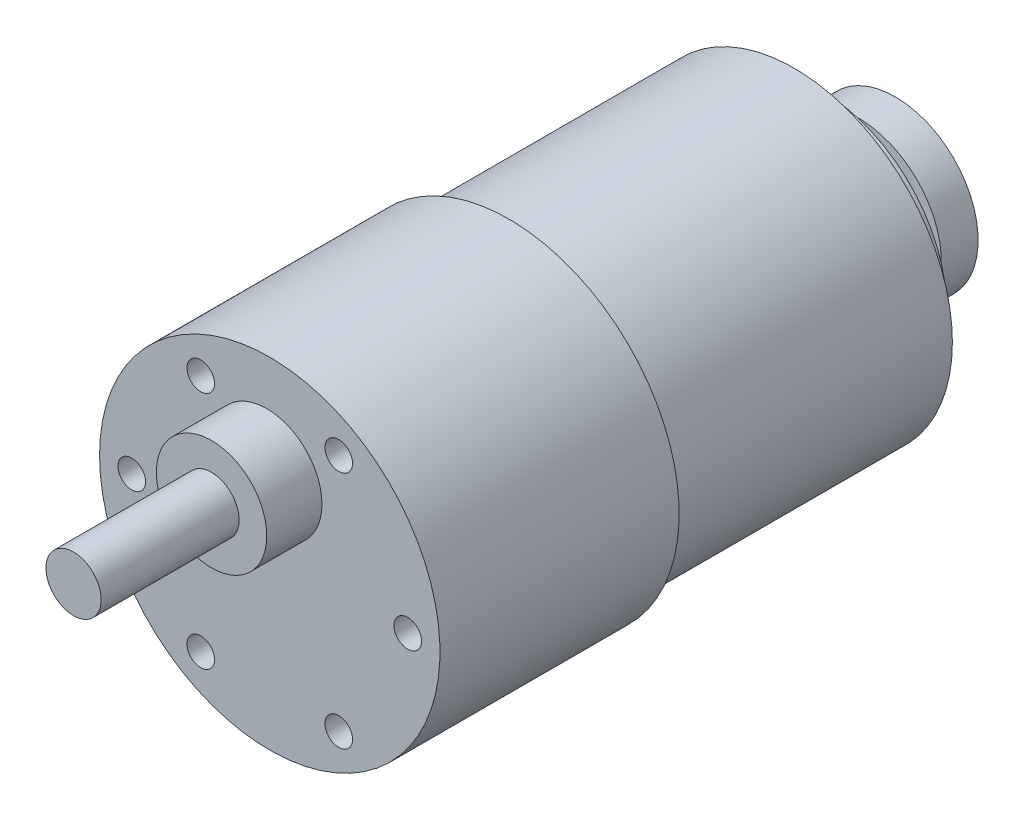
ISO-10303-21;
HEADER;
FILE_DESCRIPTION(('STEP AP214'),'2;1');
FILE_NAME('part.step','',(''),(''),'','','');
FILE_SCHEMA(('AUTOMOTIVE_DESIGN { 1 0 10303 214 1 1 1 1 }'));
ENDSEC;
DATA;
#1=APPLICATION_CONTEXT('core data for automotive mechanical design processes');
#2=APPLICATION_PROTOCOL_DEFINITION('international standard','automotive_design',2000,#1);
#3=PRODUCT_CONTEXT('',#1,'mechanical');
#4=PRODUCT('Part','Part','',(#3));
#5=PRODUCT_RELATED_PRODUCT_CATEGORY('part','',(#4));
#6=PRODUCT_DEFINITION_FORMATION('','',#4);
#7=PRODUCT_DEFINITION_CONTEXT('part definition',#1,'design');
#8=PRODUCT_DEFINITION('design','',#6,#7);
#9=PRODUCT_DEFINITION_SHAPE('','',#8);
#10=(LENGTH_UNIT() NAMED_UNIT(*) SI_UNIT(.MILLI.,.METRE.));
#11=(NAMED_UNIT(*) PLANE_ANGLE_UNIT() SI_UNIT($,.RADIAN.));
#12=(NAMED_UNIT(*) SI_UNIT($,.STERADIAN.) SOLID_ANGLE_UNIT());
#13=UNCERTAINTY_MEASURE_WITH_UNIT(LENGTH_MEASURE(1.E-05),#10,'distance_accuracy_value','');
#14=(GEOMETRIC_REPRESENTATION_CONTEXT(3) GLOBAL_UNCERTAINTY_ASSIGNED_CONTEXT((#13)) GLOBAL_UNIT_ASSIGNED_CONTEXT((#10,
#11,#12)) REPRESENTATION_CONTEXT('',''));
#15=CARTESIAN_POINT('',(0.,0.,0.));
#16=DIRECTION('',(0.,0.,1.));
#17=DIRECTION('',(1.,0.,0.));
#18=AXIS2_PLACEMENT_3D('',#15,#16,#17);
#19=CARTESIAN_POINT('',(0.,0.,26.));
#20=DIRECTION('',(0.,0.,-1.));
#21=DIRECTION('',(-1.,0.,0.));
#22=AXIS2_PLACEMENT_3D('',#19,#20,#21);
#23=CYLINDRICAL_SURFACE('',#22,18.5);
#24=CARTESIAN_POINT('',(0.,0.,26.));
#25=DIRECTION('',(0.,0.,1.));
#26=DIRECTION('',(1.,0.,0.));
#27=AXIS2_PLACEMENT_3D('',#24,#25,#26);
#28=CIRCLE('',#27,18.5);
#29=CARTESIAN_POINT('',(-18.5,0.,26.));
#30=VERTEX_POINT('',#29);
#31=EDGE_CURVE('E36',#30,#30,#28,.T.);
#32=CARTESIAN_POINT('',(0.,0.,0.));
#33=DIRECTION('',(0.,0.,1.));
#34=DIRECTION('',(1.,0.,0.));
#35=AXIS2_PLACEMENT_3D('',#32,#33,#34);
#36=CIRCLE('',#35,18.5);
#37=CARTESIAN_POINT('',(-18.5,0.,0.));
#38=VERTEX_POINT('',#37);
#39=EDGE_CURVE('E40',#38,#38,#36,.T.);
#40=CARTESIAN_POINT('',(-18.5,0.,26.));
#41=CARTESIAN_POINT('',(-18.5,0.,25.7291666666667));
#42=CARTESIAN_POINT('',(-18.5,0.,25.4583333333333));
#43=CARTESIAN_POINT('',(-18.5,0.,24.9166666666667));
#44=CARTESIAN_POINT('',(-18.5,0.,24.6458333333333));
#45=CARTESIAN_POINT('',(-18.5,0.,24.1041666666667));
#46=CARTESIAN_POINT('',(-18.5,0.,23.8333333333333));
#47=CARTESIAN_POINT('',(-18.5,0.,23.2916666666667));
#48=CARTESIAN_POINT('',(-18.5,0.,23.0208333333333));
#49=CARTESIAN_POINT('',(-18.5,0.,22.4791666666667));
#50=CARTESIAN_POINT('',(-18.5,0.,22.2083333333333));
#51=CARTESIAN_POINT('',(-18.5,0.,21.6666666666667));
#52=CARTESIAN_POINT('',(-18.5,0.,21.3958333333333));
#53=CARTESIAN_POINT('',(-18.5,0.,20.8541666666667));
#54=CARTESIAN_POINT('',(-18.5,0.,20.5833333333333));
#55=CARTESIAN_POINT('',(-18.5,0.,20.0416666666667));
#56=CARTESIAN_POINT('',(-18.5,0.,19.7708333333333));
#57=CARTESIAN_POINT('',(-18.5,0.,19.2291666666667));
#58=CARTESIAN_POINT('',(-18.5,0.,18.9583333333333));
#59=CARTESIAN_POINT('',(-18.5,0.,18.4166666666667));
#60=CARTESIAN_POINT('',(-18.5,0.,18.1458333333333));
#61=CARTESIAN_POINT('',(-18.5,0.,17.6041666666667));
#62=CARTESIAN_POINT('',(-18.5,0.,17.3333333333333));
#63=CARTESIAN_POINT('',(-18.5,0.,16.7916666666667));
#64=CARTESIAN_POINT('',(-18.5,0.,16.5208333333333));
#65=CARTESIAN_POINT('',(-18.5,0.,15.9791666666667));
#66=CARTESIAN_POINT('',(-18.5,0.,15.7083333333333));
#67=CARTESIAN_POINT('',(-18.5,0.,15.1666666666667));
#68=CARTESIAN_POINT('',(-18.5,0.,14.8958333333333));
#69=CARTESIAN_POINT('',(-18.5,0.,14.3541666666667));
#70=CARTESIAN_POINT('',(-18.5,0.,14.0833333333333));
#71=CARTESIAN_POINT('',(-18.5,0.,13.5416666666667));
#72=CARTESIAN_POINT('',(-18.5,0.,13.2708333333333));
#73=CARTESIAN_POINT('',(-18.5,0.,12.7291666666667));
#74=CARTESIAN_POINT('',(-18.5,0.,12.4583333333333));
#75=CARTESIAN_POINT('',(-18.5,0.,11.9166666666667));
#76=CARTESIAN_POINT('',(-18.5,0.,11.6458333333333));
#77=CARTESIAN_POINT('',(-18.5,0.,11.1041666666667));
#78=CARTESIAN_POINT('',(-18.5,0.,10.8333333333333));
#79=CARTESIAN_POINT('',(-18.5,0.,10.2916666666667));
#80=CARTESIAN_POINT('',(-18.5,0.,10.0208333333333));
#81=CARTESIAN_POINT('',(-18.5,0.,9.47916666666667));
#82=CARTESIAN_POINT('',(-18.5,0.,9.20833333333333));
#83=CARTESIAN_POINT('',(-18.5,0.,8.66666666666667));
#84=CARTESIAN_POINT('',(-18.5,0.,8.39583333333333));
#85=CARTESIAN_POINT('',(-18.5,0.,7.85416666666667));
#86=CARTESIAN_POINT('',(-18.5,0.,7.58333333333333));
#87=CARTESIAN_POINT('',(-18.5,0.,7.04166666666667));
#88=CARTESIAN_POINT('',(-18.5,0.,6.77083333333333));
#89=CARTESIAN_POINT('',(-18.5,0.,6.22916666666667));
#90=CARTESIAN_POINT('',(-18.5,0.,5.95833333333333));
#91=CARTESIAN_POINT('',(-18.5,0.,5.41666666666667));
#92=CARTESIAN_POINT('',(-18.5,0.,5.14583333333333));
#93=CARTESIAN_POINT('',(-18.5,0.,4.60416666666667));
#94=CARTESIAN_POINT('',(-18.5,0.,4.33333333333333));
#95=CARTESIAN_POINT('',(-18.5,0.,3.79166666666667));
#96=CARTESIAN_POINT('',(-18.5,0.,3.52083333333333));
#97=CARTESIAN_POINT('',(-18.5,0.,2.97916666666667));
#98=CARTESIAN_POINT('',(-18.5,0.,2.70833333333333));
#99=CARTESIAN_POINT('',(-18.5,0.,2.16666666666667));
#100=CARTESIAN_POINT('',(-18.5,0.,1.89583333333333));
#101=CARTESIAN_POINT('',(-18.5,0.,1.35416666666667));
#102=CARTESIAN_POINT('',(-18.5,0.,1.08333333333333));
#103=CARTESIAN_POINT('',(-18.5,0.,0.541666666666667));
#104=CARTESIAN_POINT('',(-18.5,0.,0.270833333333334));
#105=CARTESIAN_POINT('',(-18.5,0.,0.));
#106=B_SPLINE_CURVE_WITH_KNOTS('',3,(#40,#41,#42,#43,#44,#45,#46,#47,#48,#49,#50,#51,#52,#53,
#54,#55,#56,#57,#58,#59,#60,#61,#62,#63,#64,#65,#66,#67,#68,#69,#70,#71,#72,#73,#74,#75,#76,#77,
#78,#79,#80,#81,#82,#83,#84,#85,#86,#87,#88,#89,#90,#91,#92,#93,#94,#95,#96,#97,#98,#99,#100,
#101,#102,#103,#104,#105),.UNSPECIFIED.,.F.,.F.,(4,2,2,2,2,2,2,2,2,2,2,2,2,2,2,2,2,2,2,2,2,2,2,
2,2,2,2,2,2,2,2,2,4),(0.,0.812500000000001,1.625,2.4375,3.25,4.0625,4.875,5.6875,6.5,7.3125,
8.125,8.9375,9.75,10.5625,11.375,12.1875,13.,13.8125,14.625,15.4375,16.25,17.0625,17.875,
18.6875,19.5,20.3125,21.125,21.9375,22.75,23.5625,24.375,25.1875,26.),.UNSPECIFIED.);
#107=EDGE_CURVE('BSEAM30',#30,#38,#106,.T.);
#108=ORIENTED_EDGE('',*,*,#31,.F.);
#109=ORIENTED_EDGE('',*,*,#39,.T.);
#110=ORIENTED_EDGE('',*,*,#107,.T.);
#111=ORIENTED_EDGE('',*,*,#107,.F.);
#112=EDGE_LOOP('',(#108,#110,#109,#111));
#113=FACE_BOUND('',#112,.T.);
#114=ADVANCED_FACE('F30',(#113),#23,.T.);
#115=CARTESIAN_POINT('',(0.,0.,26.));
#116=DIRECTION('',(0.,0.,1.));
#117=DIRECTION('',(1.,0.,0.));
#118=AXIS2_PLACEMENT_3D('',#115,#116,#117);
#119=PLANE('',#118);
#120=CARTESIAN_POINT('',(-7.5,-12.9903810567666,26.));
#121=DIRECTION('',(0.,0.,1.));
#122=DIRECTION('',(1.,0.,0.));
#123=AXIS2_PLACEMENT_3D('',#120,#121,#122);
#124=CIRCLE('',#123,1.5);
#125=CARTESIAN_POINT('',(-6.,-12.9903810567666,26.));
#126=VERTEX_POINT('',#125);
#127=EDGE_CURVE('E107',#126,#126,#124,.T.);
#128=ORIENTED_EDGE('',*,*,#127,.F.);
#129=EDGE_LOOP('',(#128));
#130=FACE_BOUND('',#129,.T.);
#131=CARTESIAN_POINT('',(-15.,0.,26.));
#132=DIRECTION('',(0.,0.,1.));
#133=DIRECTION('',(1.,0.,0.));
#134=AXIS2_PLACEMENT_3D('',#131,#132,#133);
#135=CIRCLE('',#134,1.5);
#136=CARTESIAN_POINT('',(-13.5,0.,26.));
#137=VERTEX_POINT('',#136);
#138=EDGE_CURVE('E101',#137,#137,#135,.T.);
#139=ORIENTED_EDGE('',*,*,#138,.F.);
#140=EDGE_LOOP('',(#139));
#141=FACE_BOUND('',#140,.T.);
#142=CARTESIAN_POINT('',(-7.5,12.9903810567666,26.));
#143=DIRECTION('',(0.,0.,1.));
#144=DIRECTION('',(1.,0.,0.));
#145=AXIS2_PLACEMENT_3D('',#142,#143,#144);
#146=CIRCLE('',#145,1.5);
#147=CARTESIAN_POINT('',(-6.,12.9903810567666,26.));
#148=VERTEX_POINT('',#147);
#149=EDGE_CURVE('E95',#148,#148,#146,.T.);
#150=ORIENTED_EDGE('',*,*,#149,.F.);
#151=EDGE_LOOP('',(#150));
#152=FACE_BOUND('',#151,.T.);
#153=CARTESIAN_POINT('',(7.5,12.9903810567666,26.));
#154=DIRECTION('',(0.,0.,1.));
#155=DIRECTION('',(1.,0.,0.));
#156=AXIS2_PLACEMENT_3D('',#153,#154,#155);
#157=CIRCLE('',#156,1.5);
#158=CARTESIAN_POINT('',(9.,12.9903810567666,26.));
#159=VERTEX_POINT('',#158);
#160=EDGE_CURVE('E89',#159,#159,#157,.T.);
#161=ORIENTED_EDGE('',*,*,#160,.F.);
#162=EDGE_LOOP('',(#161));
#163=FACE_BOUND('',#162,.T.);
#164=CARTESIAN_POINT('',(7.5,-12.9903810567666,26.));
#165=DIRECTION('',(0.,0.,1.));
#166=DIRECTION('',(1.,0.,0.));
#167=AXIS2_PLACEMENT_3D('',#164,#165,#166);
#168=CIRCLE('',#167,1.5);
#169=CARTESIAN_POINT('',(9.,-12.9903810567666,26.));
#170=VERTEX_POINT('',#169);
#171=EDGE_CURVE('E83',#170,#170,#168,.T.);
#172=ORIENTED_EDGE('',*,*,#171,.F.);
#173=EDGE_LOOP('',(#172));
#174=FACE_BOUND('',#173,.T.);
#175=CARTESIAN_POINT('',(15.,0.,26.));
#176=DIRECTION('',(0.,0.,1.));
#177=DIRECTION('',(1.,0.,0.));
#178=AXIS2_PLACEMENT_3D('',#175,#176,#177);
#179=CIRCLE('',#178,1.5);
#180=CARTESIAN_POINT('',(16.5,0.,26.));
#181=VERTEX_POINT('',#180);
#182=EDGE_CURVE('E80',#181,#181,#179,.T.);
#183=ORIENTED_EDGE('',*,*,#182,.F.);
#184=EDGE_LOOP('',(#183));
#185=FACE_BOUND('',#184,.T.);
#186=CARTESIAN_POINT('',(-0.326961586268264,7.4928696853145,26.));
#187=DIRECTION('',(0.,0.,1.));
#188=DIRECTION('',(1.,0.,0.));
#189=AXIS2_PLACEMENT_3D('',#186,#187,#188);
#190=CIRCLE('',#189,6.);
#191=CARTESIAN_POINT('',(5.67303841373174,7.4928696853145,26.));
#192=VERTEX_POINT('',#191);
#193=EDGE_CURVE('E68',#192,#192,#190,.T.);
#194=ORIENTED_EDGE('',*,*,#193,.F.);
#195=EDGE_LOOP('',(#194));
#196=FACE_BOUND('',#195,.T.);
#197=ORIENTED_EDGE('',*,*,#31,.T.);
#198=EDGE_LOOP('',(#197));
#199=FACE_BOUND('',#198,.T.);
#200=ADVANCED_FACE('F118',(#130,#141,#152,#163,#174,#185,#196,#199),#119,.T.);
#201=CARTESIAN_POINT('',(0.,0.,0.));
#202=DIRECTION('',(0.,0.,1.));
#203=DIRECTION('',(1.,0.,0.));
#204=AXIS2_PLACEMENT_3D('',#201,#202,#203);
#205=PLANE('',#204);
#206=CARTESIAN_POINT('',(0.,0.,0.));
#207=DIRECTION('',(0.,0.,1.));
#208=DIRECTION('',(1.,0.,0.));
#209=AXIS2_PLACEMENT_3D('',#206,#207,#208);
#210=CIRCLE('',#209,17.2);
#211=CARTESIAN_POINT('',(17.2,0.,0.));
#212=VERTEX_POINT('',#211);
#213=EDGE_CURVE('E10',#212,#212,#210,.F.);
#214=ORIENTED_EDGE('',*,*,#213,.F.);
#215=EDGE_LOOP('',(#214));
#216=FACE_BOUND('',#215,.T.);
#217=ORIENTED_EDGE('',*,*,#39,.F.);
#218=EDGE_LOOP('',(#217));
#219=FACE_BOUND('',#218,.T.);
#220=ADVANCED_FACE('F121',(#216,#219),#205,.F.);
#221=CARTESIAN_POINT('',(0.,0.,-31.));
#222=DIRECTION('',(0.,0.,1.));
#223=DIRECTION('',(1.,0.,0.));
#224=AXIS2_PLACEMENT_3D('',#221,#222,#223);
#225=CYLINDRICAL_SURFACE('',#224,17.2);
#226=CARTESIAN_POINT('',(0.,0.,-31.));
#227=DIRECTION('',(0.,0.,-1.));
#228=DIRECTION('',(-1.,0.,0.));
#229=AXIS2_PLACEMENT_3D('',#226,#227,#228);
#230=CIRCLE('',#229,17.2);
#231=CARTESIAN_POINT('',(-17.2,0.,-31.));
#232=VERTEX_POINT('',#231);
#233=EDGE_CURVE('E45',#232,#232,#230,.T.);
#234=ORIENTED_EDGE('',*,*,#233,.F.);
#235=EDGE_LOOP('',(#234));
#236=FACE_BOUND('',#235,.T.);
#237=ORIENTED_EDGE('',*,*,#213,.T.);
#238=EDGE_LOOP('',(#237));
#239=FACE_BOUND('',#238,.T.);
#240=ADVANCED_FACE('F161',(#236,#239),#225,.T.);
#241=CARTESIAN_POINT('',(0.,0.,-31.));
#242=DIRECTION('',(0.,0.,-1.));
#243=DIRECTION('',(-1.,0.,0.));
#244=AXIS2_PLACEMENT_3D('',#241,#242,#243);
#245=PLANE('',#244);
#246=CARTESIAN_POINT('',(0.,0.,-31.));
#247=DIRECTION('',(0.,0.,-1.));
#248=DIRECTION('',(-1.,0.,0.));
#249=AXIS2_PLACEMENT_3D('',#246,#247,#248);
#250=CIRCLE('',#249,13.55);
#251=CARTESIAN_POINT('',(-13.55,0.,-31.));
#252=VERTEX_POINT('',#251);
#253=EDGE_CURVE('E50',#252,#252,#250,.T.);
#254=ORIENTED_EDGE('',*,*,#253,.F.);
#255=EDGE_LOOP('',(#254));
#256=FACE_BOUND('',#255,.T.);
#257=ORIENTED_EDGE('',*,*,#233,.T.);
#258=EDGE_LOOP('',(#257));
#259=FACE_BOUND('',#258,.T.);
#260=ADVANCED_FACE('F166',(#256,#259),#245,.T.);
#261=CARTESIAN_POINT('',(0.,0.,-34.));
#262=DIRECTION('',(0.,0.,1.));
#263=DIRECTION('',(1.,0.,0.));
#264=AXIS2_PLACEMENT_3D('',#261,#262,#263);
#265=CYLINDRICAL_SURFACE('',#264,13.55);
#266=CARTESIAN_POINT('',(0.,0.,-34.));
#267=DIRECTION('',(0.,0.,-1.));
#268=DIRECTION('',(-1.,0.,0.));
#269=AXIS2_PLACEMENT_3D('',#266,#267,#268);
#270=CIRCLE('',#269,13.55);
#271=CARTESIAN_POINT('',(-13.55,0.,-34.));
#272=VERTEX_POINT('',#271);
#273=EDGE_CURVE('E49',#272,#272,#270,.T.);
#274=ORIENTED_EDGE('',*,*,#273,.F.);
#275=EDGE_LOOP('',(#274));
#276=FACE_BOUND('',#275,.T.);
#277=ORIENTED_EDGE('',*,*,#253,.T.);
#278=EDGE_LOOP('',(#277));
#279=FACE_BOUND('',#278,.T.);
#280=ADVANCED_FACE('F172',(#276,#279),#265,.T.);
#281=CARTESIAN_POINT('',(0.,0.,-34.));
#282=DIRECTION('',(0.,0.,-1.));
#283=DIRECTION('',(-1.,0.,0.));
#284=AXIS2_PLACEMENT_3D('',#281,#282,#283);
#285=PLANE('',#284);
#286=CARTESIAN_POINT('',(0.,0.,-34.));
#287=DIRECTION('',(0.,0.,-1.));
#288=DIRECTION('',(-1.,0.,0.));
#289=AXIS2_PLACEMENT_3D('',#286,#287,#288);
#290=CIRCLE('',#289,0.75);
#291=CARTESIAN_POINT('',(-0.75,0.,-34.));
#292=VERTEX_POINT('',#291);
#293=EDGE_CURVE('E56',#292,#292,#290,.T.);
#294=ORIENTED_EDGE('',*,*,#293,.F.);
#295=EDGE_LOOP('',(#294));
#296=FACE_BOUND('',#295,.T.);
#297=ORIENTED_EDGE('',*,*,#273,.T.);
#298=EDGE_LOOP('',(#297));
#299=FACE_BOUND('',#298,.T.);
#300=ADVANCED_FACE('F176',(#296,#299),#285,.T.);
#301=CARTESIAN_POINT('',(0.,0.,-38.));
#302=DIRECTION('',(0.,0.,1.));
#303=DIRECTION('',(1.,0.,0.));
#304=AXIS2_PLACEMENT_3D('',#301,#302,#303);
#305=CYLINDRICAL_SURFACE('',#304,0.75);
#306=CARTESIAN_POINT('',(0.,0.,-38.));
#307=DIRECTION('',(0.,0.,-1.));
#308=DIRECTION('',(-1.,0.,0.));
#309=AXIS2_PLACEMENT_3D('',#306,#307,#308);
#310=CIRCLE('',#309,0.75);
#311=CARTESIAN_POINT('',(-0.75,0.,-38.));
#312=VERTEX_POINT('',#311);
#313=EDGE_CURVE('E53',#312,#312,#310,.T.);
#314=ORIENTED_EDGE('',*,*,#313,.F.);
#315=EDGE_LOOP('',(#314));
#316=FACE_BOUND('',#315,.T.);
#317=ORIENTED_EDGE('',*,*,#293,.T.);
#318=EDGE_LOOP('',(#317));
#319=FACE_BOUND('',#318,.T.);
#320=ADVANCED_FACE('F180',(#316,#319),#305,.T.);
#321=CARTESIAN_POINT('',(0.,0.,-42.));
#322=DIRECTION('',(0.,0.,1.));
#323=DIRECTION('',(1.,0.,0.));
#324=AXIS2_PLACEMENT_3D('',#321,#322,#323);
#325=CYLINDRICAL_SURFACE('',#324,9.);
#326=CARTESIAN_POINT('',(0.,0.,-42.));
#327=DIRECTION('',(0.,0.,-1.));
#328=DIRECTION('',(-1.,0.,0.));
#329=AXIS2_PLACEMENT_3D('',#326,#327,#328);
#330=CIRCLE('',#329,9.);
#331=CARTESIAN_POINT('',(-9.,0.,-42.));
#332=VERTEX_POINT('',#331);
#333=EDGE_CURVE('E59',#332,#332,#330,.T.);
#334=ORIENTED_EDGE('',*,*,#333,.F.);
#335=EDGE_LOOP('',(#334));
#336=FACE_BOUND('',#335,.T.);
#337=CARTESIAN_POINT('',(0.,0.,-38.));
#338=DIRECTION('',(0.,0.,-1.));
#339=DIRECTION('',(-1.,0.,0.));
#340=AXIS2_PLACEMENT_3D('',#337,#338,#339);
#341=CIRCLE('',#340,9.);
#342=CARTESIAN_POINT('',(-9.,0.,-38.));
#343=VERTEX_POINT('',#342);
#344=EDGE_CURVE('E62',#343,#343,#341,.T.);
#345=ORIENTED_EDGE('',*,*,#344,.T.);
#346=EDGE_LOOP('',(#345));
#347=FACE_BOUND('',#346,.T.);
#348=ADVANCED_FACE('F184',(#336,#347),#325,.T.);
#349=CARTESIAN_POINT('',(0.,0.,-42.));
#350=DIRECTION('',(0.,0.,-1.));
#351=DIRECTION('',(-1.,0.,0.));
#352=AXIS2_PLACEMENT_3D('',#349,#350,#351);
#353=PLANE('',#352);
#354=ORIENTED_EDGE('',*,*,#333,.T.);
#355=EDGE_LOOP('',(#354));
#356=FACE_BOUND('',#355,.T.);
#357=ADVANCED_FACE('F148',(#356),#353,.T.);
#358=CARTESIAN_POINT('',(0.,0.,-38.));
#359=DIRECTION('',(0.,0.,-1.));
#360=DIRECTION('',(-1.,0.,0.));
#361=AXIS2_PLACEMENT_3D('',#358,#359,#360);
#362=PLANE('',#361);
#363=ORIENTED_EDGE('',*,*,#313,.T.);
#364=EDGE_LOOP('',(#363));
#365=FACE_BOUND('',#364,.T.);
#366=ORIENTED_EDGE('',*,*,#344,.F.);
#367=EDGE_LOOP('',(#366));
#368=FACE_BOUND('',#367,.T.);
#369=ADVANCED_FACE('F138',(#365,#368),#362,.F.);
#370=CARTESIAN_POINT('',(-0.326961586268264,7.4928696853145,32.));
#371=DIRECTION('',(0.,0.,-1.));
#372=DIRECTION('',(-1.,0.,0.));
#373=AXIS2_PLACEMENT_3D('',#370,#371,#372);
#374=CYLINDRICAL_SURFACE('',#373,6.);
#375=CARTESIAN_POINT('',(-0.326961586268264,7.4928696853145,32.));
#376=DIRECTION('',(0.,0.,1.));
#377=DIRECTION('',(1.,0.,0.));
#378=AXIS2_PLACEMENT_3D('',#375,#376,#377);
#379=CIRCLE('',#378,6.);
#380=CARTESIAN_POINT('',(5.67303841373174,7.4928696853145,32.));
#381=VERTEX_POINT('',#380);
#382=EDGE_CURVE('E65',#381,#381,#379,.T.);
#383=ORIENTED_EDGE('',*,*,#382,.F.);
#384=EDGE_LOOP('',(#383));
#385=FACE_BOUND('',#384,.T.);
#386=ORIENTED_EDGE('',*,*,#193,.T.);
#387=EDGE_LOOP('',(#386));
#388=FACE_BOUND('',#387,.T.);
#389=ADVANCED_FACE('F135',(#385,#388),#374,.T.);
#390=CARTESIAN_POINT('',(-0.326961586268264,7.4928696853145,32.));
#391=DIRECTION('',(0.,0.,1.));
#392=DIRECTION('',(1.,0.,0.));
#393=AXIS2_PLACEMENT_3D('',#390,#391,#392);
#394=PLANE('',#393);
#395=CARTESIAN_POINT('',(-0.326961586268264,7.4928696853145,32.));
#396=DIRECTION('',(0.,0.,1.));
#397=DIRECTION('',(1.,0.,0.));
#398=AXIS2_PLACEMENT_3D('',#395,#396,#397);
#399=CIRCLE('',#398,3.);
#400=CARTESIAN_POINT('',(2.67303841373174,7.4928696853145,32.));
#401=VERTEX_POINT('',#400);
#402=EDGE_CURVE('E74',#401,#401,#399,.T.);
#403=ORIENTED_EDGE('',*,*,#402,.F.);
#404=EDGE_LOOP('',(#403));
#405=FACE_BOUND('',#404,.T.);
#406=ORIENTED_EDGE('',*,*,#382,.T.);
#407=EDGE_LOOP('',(#406));
#408=FACE_BOUND('',#407,.T.);
#409=ADVANCED_FACE('F137',(#405,#408),#394,.T.);
#410=CARTESIAN_POINT('',(-0.326961586268264,7.4928696853145,47.));
#411=DIRECTION('',(0.,0.,-1.));
#412=DIRECTION('',(-1.,0.,0.));
#413=AXIS2_PLACEMENT_3D('',#410,#411,#412);
#414=CYLINDRICAL_SURFACE('',#413,3.);
#415=CARTESIAN_POINT('',(-0.326961586268264,7.4928696853145,47.));
#416=DIRECTION('',(0.,0.,1.));
#417=DIRECTION('',(1.,0.,0.));
#418=AXIS2_PLACEMENT_3D('',#415,#416,#417);
#419=CIRCLE('',#418,3.);
#420=CARTESIAN_POINT('',(2.67303841373174,7.4928696853145,47.));
#421=VERTEX_POINT('',#420);
#422=EDGE_CURVE('E71',#421,#421,#419,.T.);
#423=ORIENTED_EDGE('',*,*,#422,.F.);
#424=EDGE_LOOP('',(#423));
#425=FACE_BOUND('',#424,.T.);
#426=ORIENTED_EDGE('',*,*,#402,.T.);
#427=EDGE_LOOP('',(#426));
#428=FACE_BOUND('',#427,.T.);
#429=ADVANCED_FACE('F145',(#425,#428),#414,.T.);
#430=CARTESIAN_POINT('',(-0.326961586268264,7.4928696853145,47.));
#431=DIRECTION('',(0.,0.,1.));
#432=DIRECTION('',(1.,0.,0.));
#433=AXIS2_PLACEMENT_3D('',#430,#431,#432);
#434=PLANE('',#433);
#435=ORIENTED_EDGE('',*,*,#422,.T.);
#436=EDGE_LOOP('',(#435));
#437=FACE_BOUND('',#436,.T.);
#438=ADVANCED_FACE('F221',(#437),#434,.T.);
#439=CARTESIAN_POINT('',(15.,0.,21.));
#440=DIRECTION('',(0.,0.,1.));
#441=DIRECTION('',(1.,0.,0.));
#442=AXIS2_PLACEMENT_3D('',#439,#440,#441);
#443=CYLINDRICAL_SURFACE('',#442,1.5);
#444=CARTESIAN_POINT('',(15.,0.,21.));
#445=DIRECTION('',(0.,0.,1.));
#446=DIRECTION('',(1.,0.,0.));
#447=AXIS2_PLACEMENT_3D('',#444,#445,#446);
#448=CIRCLE('',#447,1.5);
#449=CARTESIAN_POINT('',(16.5,0.,21.));
#450=VERTEX_POINT('',#449);
#451=EDGE_CURVE('E77',#450,#450,#448,.T.);
#452=ORIENTED_EDGE('',*,*,#451,.F.);
#453=EDGE_LOOP('',(#452));
#454=FACE_BOUND('',#453,.T.);
#455=ORIENTED_EDGE('',*,*,#182,.T.);
#456=EDGE_LOOP('',(#455));
#457=FACE_BOUND('',#456,.T.);
#458=ADVANCED_FACE('F231',(#454,#457),#443,.F.);
#459=CARTESIAN_POINT('',(15.,0.,21.));
#460=DIRECTION('',(0.,0.,1.));
#461=DIRECTION('',(1.,0.,0.));
#462=AXIS2_PLACEMENT_3D('',#459,#460,#461);
#463=PLANE('',#462);
#464=ORIENTED_EDGE('',*,*,#451,.T.);
#465=EDGE_LOOP('',(#464));
#466=FACE_BOUND('',#465,.T.);
#467=ADVANCED_FACE('F249',(#466),#463,.T.);
#468=CARTESIAN_POINT('',(7.5,-12.9903810567666,21.));
#469=DIRECTION('',(0.,0.,1.));
#470=DIRECTION('',(1.,0.,0.));
#471=AXIS2_PLACEMENT_3D('',#468,#469,#470);
#472=CYLINDRICAL_SURFACE('',#471,1.5);
#473=CARTESIAN_POINT('',(7.5,-12.9903810567666,21.));
#474=DIRECTION('',(0.,0.,1.));
#475=DIRECTION('',(1.,0.,0.));
#476=AXIS2_PLACEMENT_3D('',#473,#474,#475);
#477=CIRCLE('',#476,1.5);
#478=CARTESIAN_POINT('',(9.,-12.9903810567666,21.));
#479=VERTEX_POINT('',#478);
#480=EDGE_CURVE('E86',#479,#479,#477,.T.);
#481=ORIENTED_EDGE('',*,*,#480,.F.);
#482=EDGE_LOOP('',(#481));
#483=FACE_BOUND('',#482,.T.);
#484=ORIENTED_EDGE('',*,*,#171,.T.);
#485=EDGE_LOOP('',(#484));
#486=FACE_BOUND('',#485,.T.);
#487=ADVANCED_FACE('F259',(#483,#486),#472,.F.);
#488=CARTESIAN_POINT('',(7.5,-12.9903810567666,21.));
#489=DIRECTION('',(0.,0.,1.));
#490=DIRECTION('',(1.,0.,0.));
#491=AXIS2_PLACEMENT_3D('',#488,#489,#490);
#492=PLANE('',#491);
#493=ORIENTED_EDGE('',*,*,#480,.T.);
#494=EDGE_LOOP('',(#493));
#495=FACE_BOUND('',#494,.T.);
#496=ADVANCED_FACE('F269',(#495),#492,.T.);
#497=CARTESIAN_POINT('',(7.5,12.9903810567666,21.));
#498=DIRECTION('',(0.,0.,1.));
#499=DIRECTION('',(1.,0.,0.));
#500=AXIS2_PLACEMENT_3D('',#497,#498,#499);
#501=CYLINDRICAL_SURFACE('',#500,1.5);
#502=CARTESIAN_POINT('',(7.5,12.9903810567666,21.));
#503=DIRECTION('',(0.,0.,1.));
#504=DIRECTION('',(1.,0.,0.));
#505=AXIS2_PLACEMENT_3D('',#502,#503,#504);
#506=CIRCLE('',#505,1.5);
#507=CARTESIAN_POINT('',(9.,12.9903810567666,21.));
#508=VERTEX_POINT('',#507);
#509=EDGE_CURVE('E92',#508,#508,#506,.T.);
#510=ORIENTED_EDGE('',*,*,#509,.F.);
#511=EDGE_LOOP('',(#510));
#512=FACE_BOUND('',#511,.T.);
#513=ORIENTED_EDGE('',*,*,#160,.T.);
#514=EDGE_LOOP('',(#513));
#515=FACE_BOUND('',#514,.T.);
#516=ADVANCED_FACE('F279',(#512,#515),#501,.F.);
#517=CARTESIAN_POINT('',(7.5,12.9903810567666,21.));
#518=DIRECTION('',(0.,0.,1.));
#519=DIRECTION('',(1.,0.,0.));
#520=AXIS2_PLACEMENT_3D('',#517,#518,#519);
#521=PLANE('',#520);
#522=ORIENTED_EDGE('',*,*,#509,.T.);
#523=EDGE_LOOP('',(#522));
#524=FACE_BOUND('',#523,.T.);
#525=ADVANCED_FACE('F289',(#524),#521,.T.);
#526=CARTESIAN_POINT('',(-7.5,12.9903810567666,21.));
#527=DIRECTION('',(0.,0.,1.));
#528=DIRECTION('',(1.,0.,0.));
#529=AXIS2_PLACEMENT_3D('',#526,#527,#528);
#530=CYLINDRICAL_SURFACE('',#529,1.5);
#531=CARTESIAN_POINT('',(-7.5,12.9903810567666,21.));
#532=DIRECTION('',(0.,0.,1.));
#533=DIRECTION('',(1.,0.,0.));
#534=AXIS2_PLACEMENT_3D('',#531,#532,#533);
#535=CIRCLE('',#534,1.5);
#536=CARTESIAN_POINT('',(-6.,12.9903810567666,21.));
#537=VERTEX_POINT('',#536);
#538=EDGE_CURVE('E98',#537,#537,#535,.T.);
#539=ORIENTED_EDGE('',*,*,#538,.F.);
#540=EDGE_LOOP('',(#539));
#541=FACE_BOUND('',#540,.T.);
#542=ORIENTED_EDGE('',*,*,#149,.T.);
#543=EDGE_LOOP('',(#542));
#544=FACE_BOUND('',#543,.T.);
#545=ADVANCED_FACE('F299',(#541,#544),#530,.F.);
#546=CARTESIAN_POINT('',(-7.5,12.9903810567666,21.));
#547=DIRECTION('',(0.,0.,1.));
#548=DIRECTION('',(1.,0.,0.));
#549=AXIS2_PLACEMENT_3D('',#546,#547,#548);
#550=PLANE('',#549);
#551=ORIENTED_EDGE('',*,*,#538,.T.);
#552=EDGE_LOOP('',(#551));
#553=FACE_BOUND('',#552,.T.);
#554=ADVANCED_FACE('F309',(#553),#550,.T.);
#555=CARTESIAN_POINT('',(-15.,0.,21.));
#556=DIRECTION('',(0.,0.,1.));
#557=DIRECTION('',(1.,0.,0.));
#558=AXIS2_PLACEMENT_3D('',#555,#556,#557);
#559=CYLINDRICAL_SURFACE('',#558,1.5);
#560=CARTESIAN_POINT('',(-15.,0.,21.));
#561=DIRECTION('',(0.,0.,1.));
#562=DIRECTION('',(1.,0.,0.));
#563=AXIS2_PLACEMENT_3D('',#560,#561,#562);
#564=CIRCLE('',#563,1.5);
#565=CARTESIAN_POINT('',(-13.5,0.,21.));
#566=VERTEX_POINT('',#565);
#567=EDGE_CURVE('E104',#566,#566,#564,.T.);
#568=ORIENTED_EDGE('',*,*,#567,.F.);
#569=EDGE_LOOP('',(#568));
#570=FACE_BOUND('',#569,.T.);
#571=ORIENTED_EDGE('',*,*,#138,.T.);
#572=EDGE_LOOP('',(#571));
#573=FACE_BOUND('',#572,.T.);
#574=ADVANCED_FACE('F319',(#570,#573),#559,.F.);
#575=CARTESIAN_POINT('',(-15.,0.,21.));
#576=DIRECTION('',(0.,0.,1.));
#577=DIRECTION('',(1.,0.,0.));
#578=AXIS2_PLACEMENT_3D('',#575,#576,#577);
#579=PLANE('',#578);
#580=ORIENTED_EDGE('',*,*,#567,.T.);
#581=EDGE_LOOP('',(#580));
#582=FACE_BOUND('',#581,.T.);
#583=ADVANCED_FACE('F329',(#582),#579,.T.);
#584=CARTESIAN_POINT('',(-7.5,-12.9903810567666,21.));
#585=DIRECTION('',(0.,0.,1.));
#586=DIRECTION('',(1.,0.,0.));
#587=AXIS2_PLACEMENT_3D('',#584,#585,#586);
#588=CYLINDRICAL_SURFACE('',#587,1.5);
#589=CARTESIAN_POINT('',(-7.5,-12.9903810567666,21.));
#590=DIRECTION('',(0.,0.,1.));
#591=DIRECTION('',(1.,0.,0.));
#592=AXIS2_PLACEMENT_3D('',#589,#590,#591);
#593=CIRCLE('',#592,1.5);
#594=CARTESIAN_POINT('',(-6.,-12.9903810567666,21.));
#595=VERTEX_POINT('',#594);
#596=EDGE_CURVE('E110',#595,#595,#593,.T.);
#597=ORIENTED_EDGE('',*,*,#596,.F.);
#598=EDGE_LOOP('',(#597));
#599=FACE_BOUND('',#598,.T.);
#600=ORIENTED_EDGE('',*,*,#127,.T.);
#601=EDGE_LOOP('',(#600));
#602=FACE_BOUND('',#601,.T.);
#603=ADVANCED_FACE('F116',(#599,#602),#588,.F.);
#604=CARTESIAN_POINT('',(-7.5,-12.9903810567666,21.));
#605=DIRECTION('',(0.,0.,1.));
#606=DIRECTION('',(1.,0.,0.));
#607=AXIS2_PLACEMENT_3D('',#604,#605,#606);
#608=PLANE('',#607);
#609=ORIENTED_EDGE('',*,*,#596,.T.);
#610=EDGE_LOOP('',(#609));
#611=FACE_BOUND('',#610,.T.);
#612=ADVANCED_FACE('F348',(#611),#608,.T.);
#613=CLOSED_SHELL('',(#114,#200,#220,#240,#260,#280,#300,#320,#348,#357,#369,#389,#409,#429,
#438,#458,#467,#487,#496,#516,#525,#545,#554,#574,#583,#603,#612));
#614=MANIFOLD_SOLID_BREP('B2',#613);
#615=ADVANCED_BREP_SHAPE_REPRESENTATION('',(#18,#614),#14);
#616=SHAPE_DEFINITION_REPRESENTATION(#9,#615);
ENDSEC;
END-ISO-10303-21;
